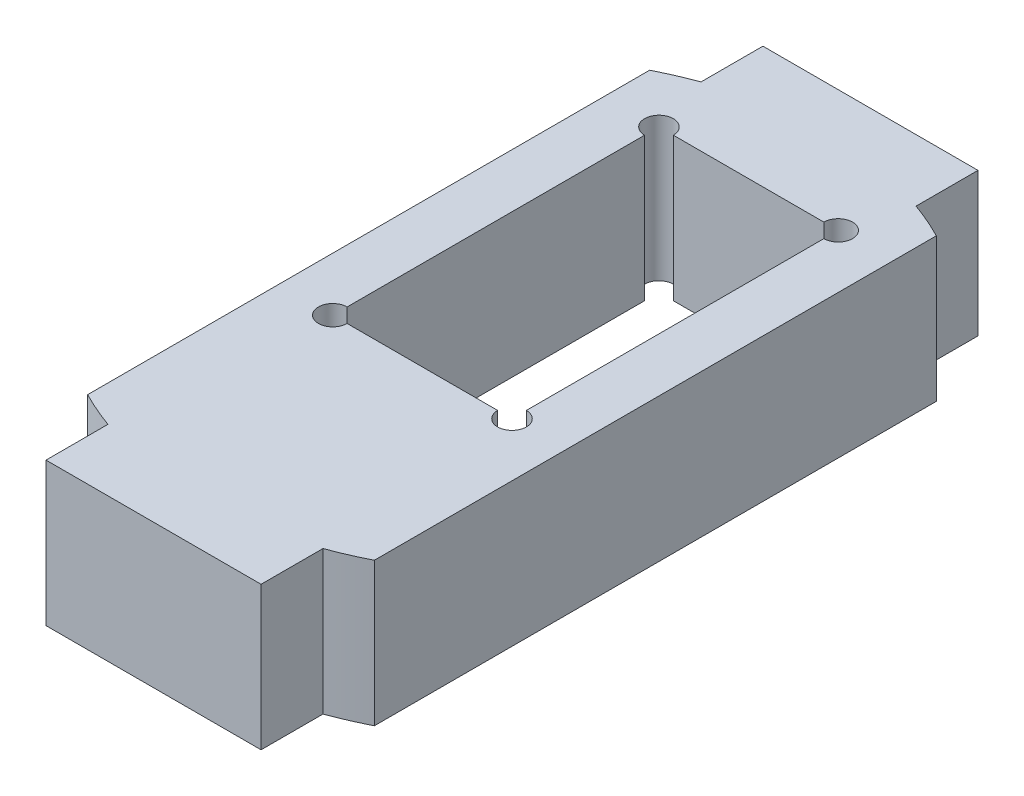
ISO-10303-21;
HEADER;
FILE_DESCRIPTION(('STEP AP214'),'2;1');
FILE_NAME('part.step','',(''),(''),'','','');
FILE_SCHEMA(('AUTOMOTIVE_DESIGN { 1 0 10303 214 1 1 1 1 }'));
ENDSEC;
DATA;
#1=APPLICATION_CONTEXT('core data for automotive mechanical design processes');
#2=APPLICATION_PROTOCOL_DEFINITION('international standard','automotive_design',2000,#1);
#3=PRODUCT_CONTEXT('',#1,'mechanical');
#4=PRODUCT('Part','Part','',(#3));
#5=PRODUCT_RELATED_PRODUCT_CATEGORY('part','',(#4));
#6=PRODUCT_DEFINITION_FORMATION('','',#4);
#7=PRODUCT_DEFINITION_CONTEXT('part definition',#1,'design');
#8=PRODUCT_DEFINITION('design','',#6,#7);
#9=PRODUCT_DEFINITION_SHAPE('','',#8);
#10=(LENGTH_UNIT() NAMED_UNIT(*) SI_UNIT(.MILLI.,.METRE.));
#11=(NAMED_UNIT(*) PLANE_ANGLE_UNIT() SI_UNIT($,.RADIAN.));
#12=(NAMED_UNIT(*) SI_UNIT($,.STERADIAN.) SOLID_ANGLE_UNIT());
#13=UNCERTAINTY_MEASURE_WITH_UNIT(LENGTH_MEASURE(1.E-05),#10,'distance_accuracy_value','');
#14=(GEOMETRIC_REPRESENTATION_CONTEXT(3) GLOBAL_UNCERTAINTY_ASSIGNED_CONTEXT((#13)) GLOBAL_UNIT_ASSIGNED_CONTEXT((#10,
#11,#12)) REPRESENTATION_CONTEXT('',''));
#15=CARTESIAN_POINT('',(0.,0.,0.));
#16=DIRECTION('',(0.,0.,1.));
#17=DIRECTION('',(1.,0.,0.));
#18=AXIS2_PLACEMENT_3D('',#15,#16,#17);
#19=CARTESIAN_POINT('',(0.,10.,0.));
#20=DIRECTION('',(0.,-1.,0.));
#21=DIRECTION('',(0.,0.,-1.));
#22=AXIS2_PLACEMENT_3D('',#19,#20,#21);
#23=CYLINDRICAL_SURFACE('',#22,22.);
#24=CARTESIAN_POINT('',(0.,0.,0.));
#25=DIRECTION('',(0.,1.,0.));
#26=DIRECTION('',(0.,0.,1.));
#27=AXIS2_PLACEMENT_3D('',#24,#25,#26);
#28=CIRCLE('',#27,22.);
#29=CARTESIAN_POINT('',(-7.49999999999999,0.,-20.6821178799464));
#30=VERTEX_POINT('',#29);
#31=CARTESIAN_POINT('',(-10.,0.,-19.5959179422654));
#32=VERTEX_POINT('',#31);
#33=EDGE_CURVE('E226',#30,#32,#28,.T.);
#34=ORIENTED_EDGE('',*,*,#33,.T.);
#35=DIRECTION('',(0.,-1.,0.));
#36=VECTOR('',#35,1.);
#37=CARTESIAN_POINT('',(-10.,10.,-19.5959179422654));
#38=LINE('',#37,#36);
#39=CARTESIAN_POINT('',(-10.,10.,-19.5959179422654));
#40=VERTEX_POINT('',#39);
#41=EDGE_CURVE('E11',#40,#32,#38,.T.);
#42=ORIENTED_EDGE('',*,*,#41,.F.);
#43=CARTESIAN_POINT('',(0.,10.,0.));
#44=DIRECTION('',(0.,1.,0.));
#45=DIRECTION('',(0.,0.,1.));
#46=AXIS2_PLACEMENT_3D('',#43,#44,#45);
#47=CIRCLE('',#46,22.);
#48=CARTESIAN_POINT('',(-7.49999999999999,10.,-20.6821178799464));
#49=VERTEX_POINT('',#48);
#50=EDGE_CURVE('E238',#49,#40,#47,.T.);
#51=ORIENTED_EDGE('',*,*,#50,.F.);
#52=DIRECTION('',(0.,-1.,0.));
#53=VECTOR('',#52,1.);
#54=CARTESIAN_POINT('',(-7.49999999999999,10.,-20.6821178799464));
#55=LINE('',#54,#53);
#56=EDGE_CURVE('E264',#49,#30,#55,.T.);
#57=ORIENTED_EDGE('',*,*,#56,.T.);
#58=EDGE_LOOP('',(#34,#42,#51,#57));
#59=FACE_BOUND('',#58,.T.);
#60=ADVANCED_FACE('F33',(#59),#23,.T.);
#61=CARTESIAN_POINT('',(-9.99999999999999,10.,19.5959179422654));
#62=DIRECTION('',(1.,0.,0.));
#63=DIRECTION('',(0.,0.,-1.));
#64=AXIS2_PLACEMENT_3D('',#61,#62,#63);
#65=PLANE('',#64);
#66=DIRECTION('',(0.,0.,1.));
#67=VECTOR('',#66,1.);
#68=CARTESIAN_POINT('',(-9.99999999999999,0.,19.5959179422654));
#69=LINE('',#68,#67);
#70=CARTESIAN_POINT('',(-9.99999999999998,0.,19.5959179422654));
#71=VERTEX_POINT('',#70);
#72=EDGE_CURVE('E267',#32,#71,#69,.T.);
#73=ORIENTED_EDGE('',*,*,#72,.T.);
#74=DIRECTION('',(0.,-1.,0.));
#75=VECTOR('',#74,1.);
#76=CARTESIAN_POINT('',(-9.99999999999998,10.,19.5959179422654));
#77=LINE('',#76,#75);
#78=CARTESIAN_POINT('',(-9.99999999999998,10.,19.5959179422654));
#79=VERTEX_POINT('',#78);
#80=EDGE_CURVE('E40',#79,#71,#77,.T.);
#81=ORIENTED_EDGE('',*,*,#80,.F.);
#82=DIRECTION('',(0.,0.,1.));
#83=VECTOR('',#82,1.);
#84=CARTESIAN_POINT('',(-9.99999999999999,10.,19.5959179422654));
#85=LINE('',#84,#83);
#86=EDGE_CURVE('E241',#40,#79,#85,.T.);
#87=ORIENTED_EDGE('',*,*,#86,.F.);
#88=ORIENTED_EDGE('',*,*,#41,.T.);
#89=EDGE_LOOP('',(#73,#81,#87,#88));
#90=FACE_BOUND('',#89,.T.);
#91=ADVANCED_FACE('F342',(#90),#65,.F.);
#92=CARTESIAN_POINT('',(0.,10.,0.));
#93=DIRECTION('',(0.,-1.,0.));
#94=DIRECTION('',(0.,0.,-1.));
#95=AXIS2_PLACEMENT_3D('',#92,#93,#94);
#96=CYLINDRICAL_SURFACE('',#95,22.);
#97=CARTESIAN_POINT('',(0.,0.,0.));
#98=DIRECTION('',(0.,1.,0.));
#99=DIRECTION('',(0.,0.,1.));
#100=AXIS2_PLACEMENT_3D('',#97,#98,#99);
#101=CIRCLE('',#100,22.);
#102=CARTESIAN_POINT('',(-7.49999999999998,0.,20.6821178799464));
#103=VERTEX_POINT('',#102);
#104=EDGE_CURVE('E269',#71,#103,#101,.T.);
#105=ORIENTED_EDGE('',*,*,#104,.T.);
#106=DIRECTION('',(0.,-1.,0.));
#107=VECTOR('',#106,1.);
#108=CARTESIAN_POINT('',(-7.49999999999998,10.,20.6821178799464));
#109=LINE('',#108,#107);
#110=CARTESIAN_POINT('',(-7.49999999999998,10.,20.6821178799464));
#111=VERTEX_POINT('',#110);
#112=EDGE_CURVE('E314',#111,#103,#109,.T.);
#113=ORIENTED_EDGE('',*,*,#112,.F.);
#114=CARTESIAN_POINT('',(0.,10.,0.));
#115=DIRECTION('',(0.,1.,0.));
#116=DIRECTION('',(0.,0.,1.));
#117=AXIS2_PLACEMENT_3D('',#114,#115,#116);
#118=CIRCLE('',#117,22.);
#119=EDGE_CURVE('E244',#79,#111,#118,.T.);
#120=ORIENTED_EDGE('',*,*,#119,.F.);
#121=ORIENTED_EDGE('',*,*,#80,.T.);
#122=EDGE_LOOP('',(#105,#113,#120,#121));
#123=FACE_BOUND('',#122,.T.);
#124=ADVANCED_FACE('F321',(#123),#96,.T.);
#125=CARTESIAN_POINT('',(-7.49999999999999,10.,25.));
#126=DIRECTION('',(1.,0.,0.));
#127=DIRECTION('',(0.,0.,-1.));
#128=AXIS2_PLACEMENT_3D('',#125,#126,#127);
#129=PLANE('',#128);
#130=DIRECTION('',(0.,0.,1.));
#131=VECTOR('',#130,1.);
#132=CARTESIAN_POINT('',(-7.49999999999999,0.,25.));
#133=LINE('',#132,#131);
#134=CARTESIAN_POINT('',(-7.49999999999999,0.,25.));
#135=VERTEX_POINT('',#134);
#136=EDGE_CURVE('E271',#103,#135,#133,.T.);
#137=ORIENTED_EDGE('',*,*,#136,.T.);
#138=DIRECTION('',(0.,-1.,0.));
#139=VECTOR('',#138,1.);
#140=CARTESIAN_POINT('',(-7.49999999999999,10.,25.));
#141=LINE('',#140,#139);
#142=CARTESIAN_POINT('',(-7.49999999999999,10.,25.));
#143=VERTEX_POINT('',#142);
#144=EDGE_CURVE('E311',#143,#135,#141,.T.);
#145=ORIENTED_EDGE('',*,*,#144,.F.);
#146=DIRECTION('',(0.,0.,1.));
#147=VECTOR('',#146,1.);
#148=CARTESIAN_POINT('',(-7.49999999999999,10.,25.));
#149=LINE('',#148,#147);
#150=EDGE_CURVE('E246',#111,#143,#149,.T.);
#151=ORIENTED_EDGE('',*,*,#150,.F.);
#152=ORIENTED_EDGE('',*,*,#112,.T.);
#153=EDGE_LOOP('',(#137,#145,#151,#152));
#154=FACE_BOUND('',#153,.T.);
#155=ADVANCED_FACE('F330',(#154),#129,.F.);
#156=CARTESIAN_POINT('',(-7.49999999999999,10.,25.));
#157=DIRECTION('',(0.,0.,-1.));
#158=DIRECTION('',(-1.,0.,0.));
#159=AXIS2_PLACEMENT_3D('',#156,#157,#158);
#160=PLANE('',#159);
#161=DIRECTION('',(1.,0.,0.));
#162=VECTOR('',#161,1.);
#163=CARTESIAN_POINT('',(-7.49999999999999,0.,25.));
#164=LINE('',#163,#162);
#165=CARTESIAN_POINT('',(7.50000000000002,0.,25.));
#166=VERTEX_POINT('',#165);
#167=EDGE_CURVE('E273',#135,#166,#164,.T.);
#168=ORIENTED_EDGE('',*,*,#167,.T.);
#169=DIRECTION('',(0.,-1.,0.));
#170=VECTOR('',#169,1.);
#171=CARTESIAN_POINT('',(7.50000000000002,10.,25.));
#172=LINE('',#171,#170);
#173=CARTESIAN_POINT('',(7.50000000000002,10.,25.));
#174=VERTEX_POINT('',#173);
#175=EDGE_CURVE('E308',#174,#166,#172,.T.);
#176=ORIENTED_EDGE('',*,*,#175,.F.);
#177=DIRECTION('',(1.,0.,0.));
#178=VECTOR('',#177,1.);
#179=CARTESIAN_POINT('',(-7.49999999999999,10.,25.));
#180=LINE('',#179,#178);
#181=EDGE_CURVE('E248',#143,#174,#180,.T.);
#182=ORIENTED_EDGE('',*,*,#181,.F.);
#183=ORIENTED_EDGE('',*,*,#144,.T.);
#184=EDGE_LOOP('',(#168,#176,#182,#183));
#185=FACE_BOUND('',#184,.T.);
#186=ADVANCED_FACE('F334',(#185),#160,.F.);
#187=CARTESIAN_POINT('',(7.50000000000002,10.,25.));
#188=DIRECTION('',(-1.,0.,0.));
#189=DIRECTION('',(0.,0.,1.));
#190=AXIS2_PLACEMENT_3D('',#187,#188,#189);
#191=PLANE('',#190);
#192=DIRECTION('',(0.,0.,-1.));
#193=VECTOR('',#192,1.);
#194=CARTESIAN_POINT('',(7.50000000000002,0.,25.));
#195=LINE('',#194,#193);
#196=CARTESIAN_POINT('',(7.50000000000001,0.,20.6821178799464));
#197=VERTEX_POINT('',#196);
#198=EDGE_CURVE('E275',#166,#197,#195,.T.);
#199=ORIENTED_EDGE('',*,*,#198,.T.);
#200=DIRECTION('',(0.,-1.,0.));
#201=VECTOR('',#200,1.);
#202=CARTESIAN_POINT('',(7.50000000000001,10.,20.6821178799464));
#203=LINE('',#202,#201);
#204=CARTESIAN_POINT('',(7.50000000000001,10.,20.6821178799464));
#205=VERTEX_POINT('',#204);
#206=EDGE_CURVE('E305',#205,#197,#203,.T.);
#207=ORIENTED_EDGE('',*,*,#206,.F.);
#208=DIRECTION('',(0.,0.,-1.));
#209=VECTOR('',#208,1.);
#210=CARTESIAN_POINT('',(7.50000000000002,10.,25.));
#211=LINE('',#210,#209);
#212=EDGE_CURVE('E250',#174,#205,#211,.T.);
#213=ORIENTED_EDGE('',*,*,#212,.F.);
#214=ORIENTED_EDGE('',*,*,#175,.T.);
#215=EDGE_LOOP('',(#199,#207,#213,#214));
#216=FACE_BOUND('',#215,.T.);
#217=ADVANCED_FACE('F375',(#216),#191,.F.);
#218=CARTESIAN_POINT('',(0.,10.,0.));
#219=DIRECTION('',(0.,-1.,0.));
#220=DIRECTION('',(0.,0.,-1.));
#221=AXIS2_PLACEMENT_3D('',#218,#219,#220);
#222=CYLINDRICAL_SURFACE('',#221,22.);
#223=CARTESIAN_POINT('',(0.,0.,0.));
#224=DIRECTION('',(0.,1.,0.));
#225=DIRECTION('',(0.,0.,1.));
#226=AXIS2_PLACEMENT_3D('',#223,#224,#225);
#227=CIRCLE('',#226,22.);
#228=CARTESIAN_POINT('',(10.,0.,19.5959179422654));
#229=VERTEX_POINT('',#228);
#230=EDGE_CURVE('E277',#197,#229,#227,.T.);
#231=ORIENTED_EDGE('',*,*,#230,.T.);
#232=DIRECTION('',(0.,-1.,0.));
#233=VECTOR('',#232,1.);
#234=CARTESIAN_POINT('',(10.,10.,19.5959179422654));
#235=LINE('',#234,#233);
#236=CARTESIAN_POINT('',(10.,10.,19.5959179422654));
#237=VERTEX_POINT('',#236);
#238=EDGE_CURVE('E302',#237,#229,#235,.T.);
#239=ORIENTED_EDGE('',*,*,#238,.F.);
#240=CARTESIAN_POINT('',(0.,10.,0.));
#241=DIRECTION('',(0.,1.,0.));
#242=DIRECTION('',(0.,0.,1.));
#243=AXIS2_PLACEMENT_3D('',#240,#241,#242);
#244=CIRCLE('',#243,22.);
#245=EDGE_CURVE('E252',#205,#237,#244,.T.);
#246=ORIENTED_EDGE('',*,*,#245,.F.);
#247=ORIENTED_EDGE('',*,*,#206,.T.);
#248=EDGE_LOOP('',(#231,#239,#246,#247));
#249=FACE_BOUND('',#248,.T.);
#250=ADVANCED_FACE('F373',(#249),#222,.T.);
#251=CARTESIAN_POINT('',(10.,10.,19.5959179422654));
#252=DIRECTION('',(-1.,0.,0.));
#253=DIRECTION('',(0.,0.,1.));
#254=AXIS2_PLACEMENT_3D('',#251,#252,#253);
#255=PLANE('',#254);
#256=DIRECTION('',(0.,0.,-1.));
#257=VECTOR('',#256,1.);
#258=CARTESIAN_POINT('',(10.,0.,19.5959179422654));
#259=LINE('',#258,#257);
#260=CARTESIAN_POINT('',(10.,0.,-19.5959179422654));
#261=VERTEX_POINT('',#260);
#262=EDGE_CURVE('E279',#229,#261,#259,.T.);
#263=ORIENTED_EDGE('',*,*,#262,.T.);
#264=DIRECTION('',(0.,-1.,0.));
#265=VECTOR('',#264,1.);
#266=CARTESIAN_POINT('',(10.,10.,-19.5959179422654));
#267=LINE('',#266,#265);
#268=CARTESIAN_POINT('',(10.,10.,-19.5959179422654));
#269=VERTEX_POINT('',#268);
#270=EDGE_CURVE('E299',#269,#261,#267,.T.);
#271=ORIENTED_EDGE('',*,*,#270,.F.);
#272=DIRECTION('',(0.,0.,-1.));
#273=VECTOR('',#272,1.);
#274=CARTESIAN_POINT('',(10.,10.,19.5959179422654));
#275=LINE('',#274,#273);
#276=EDGE_CURVE('E254',#237,#269,#275,.T.);
#277=ORIENTED_EDGE('',*,*,#276,.F.);
#278=ORIENTED_EDGE('',*,*,#238,.T.);
#279=EDGE_LOOP('',(#263,#271,#277,#278));
#280=FACE_BOUND('',#279,.T.);
#281=ADVANCED_FACE('F369',(#280),#255,.F.);
#282=CARTESIAN_POINT('',(0.,10.,0.));
#283=DIRECTION('',(0.,-1.,0.));
#284=DIRECTION('',(0.,0.,-1.));
#285=AXIS2_PLACEMENT_3D('',#282,#283,#284);
#286=CYLINDRICAL_SURFACE('',#285,22.);
#287=CARTESIAN_POINT('',(0.,0.,0.));
#288=DIRECTION('',(0.,1.,0.));
#289=DIRECTION('',(0.,0.,1.));
#290=AXIS2_PLACEMENT_3D('',#287,#288,#289);
#291=CIRCLE('',#290,22.);
#292=CARTESIAN_POINT('',(7.50000000000001,0.,-20.6821178799464));
#293=VERTEX_POINT('',#292);
#294=EDGE_CURVE('E281',#261,#293,#291,.T.);
#295=ORIENTED_EDGE('',*,*,#294,.T.);
#296=DIRECTION('',(0.,-1.,0.));
#297=VECTOR('',#296,1.);
#298=CARTESIAN_POINT('',(7.50000000000001,10.,-20.6821178799464));
#299=LINE('',#298,#297);
#300=CARTESIAN_POINT('',(7.50000000000001,10.,-20.6821178799464));
#301=VERTEX_POINT('',#300);
#302=EDGE_CURVE('E296',#301,#293,#299,.T.);
#303=ORIENTED_EDGE('',*,*,#302,.F.);
#304=CARTESIAN_POINT('',(0.,10.,0.));
#305=DIRECTION('',(0.,1.,0.));
#306=DIRECTION('',(0.,0.,1.));
#307=AXIS2_PLACEMENT_3D('',#304,#305,#306);
#308=CIRCLE('',#307,22.);
#309=EDGE_CURVE('E256',#269,#301,#308,.T.);
#310=ORIENTED_EDGE('',*,*,#309,.F.);
#311=ORIENTED_EDGE('',*,*,#270,.T.);
#312=EDGE_LOOP('',(#295,#303,#310,#311));
#313=FACE_BOUND('',#312,.T.);
#314=ADVANCED_FACE('F364',(#313),#286,.T.);
#315=CARTESIAN_POINT('',(7.50000000000001,10.,-20.6821178799464));
#316=DIRECTION('',(-1.,0.,0.));
#317=DIRECTION('',(0.,0.,1.));
#318=AXIS2_PLACEMENT_3D('',#315,#316,#317);
#319=PLANE('',#318);
#320=DIRECTION('',(0.,0.,-1.));
#321=VECTOR('',#320,1.);
#322=CARTESIAN_POINT('',(7.50000000000001,0.,-20.6821178799464));
#323=LINE('',#322,#321);
#324=CARTESIAN_POINT('',(7.50000000000001,0.,-25.));
#325=VERTEX_POINT('',#324);
#326=EDGE_CURVE('E283',#293,#325,#323,.T.);
#327=ORIENTED_EDGE('',*,*,#326,.T.);
#328=DIRECTION('',(0.,-1.,0.));
#329=VECTOR('',#328,1.);
#330=CARTESIAN_POINT('',(7.50000000000001,10.,-25.));
#331=LINE('',#330,#329);
#332=CARTESIAN_POINT('',(7.50000000000001,10.,-25.));
#333=VERTEX_POINT('',#332);
#334=EDGE_CURVE('E293',#333,#325,#331,.T.);
#335=ORIENTED_EDGE('',*,*,#334,.F.);
#336=DIRECTION('',(0.,0.,-1.));
#337=VECTOR('',#336,1.);
#338=CARTESIAN_POINT('',(7.50000000000001,10.,-20.6821178799464));
#339=LINE('',#338,#337);
#340=EDGE_CURVE('E258',#301,#333,#339,.T.);
#341=ORIENTED_EDGE('',*,*,#340,.F.);
#342=ORIENTED_EDGE('',*,*,#302,.T.);
#343=EDGE_LOOP('',(#327,#335,#341,#342));
#344=FACE_BOUND('',#343,.T.);
#345=ADVANCED_FACE('F358',(#344),#319,.F.);
#346=CARTESIAN_POINT('',(-7.49999999999999,10.,-25.));
#347=DIRECTION('',(0.,0.,1.));
#348=DIRECTION('',(1.,0.,0.));
#349=AXIS2_PLACEMENT_3D('',#346,#347,#348);
#350=PLANE('',#349);
#351=DIRECTION('',(-1.,0.,0.));
#352=VECTOR('',#351,1.);
#353=CARTESIAN_POINT('',(-7.49999999999999,0.,-25.));
#354=LINE('',#353,#352);
#355=CARTESIAN_POINT('',(-7.49999999999999,0.,-25.));
#356=VERTEX_POINT('',#355);
#357=EDGE_CURVE('E285',#325,#356,#354,.T.);
#358=ORIENTED_EDGE('',*,*,#357,.T.);
#359=DIRECTION('',(0.,-1.,0.));
#360=VECTOR('',#359,1.);
#361=CARTESIAN_POINT('',(-7.49999999999999,10.,-25.));
#362=LINE('',#361,#360);
#363=CARTESIAN_POINT('',(-7.49999999999999,10.,-25.));
#364=VERTEX_POINT('',#363);
#365=EDGE_CURVE('E290',#364,#356,#362,.T.);
#366=ORIENTED_EDGE('',*,*,#365,.F.);
#367=DIRECTION('',(-1.,0.,0.));
#368=VECTOR('',#367,1.);
#369=CARTESIAN_POINT('',(-7.49999999999999,10.,-25.));
#370=LINE('',#369,#368);
#371=EDGE_CURVE('E260',#333,#364,#370,.T.);
#372=ORIENTED_EDGE('',*,*,#371,.F.);
#373=ORIENTED_EDGE('',*,*,#334,.T.);
#374=EDGE_LOOP('',(#358,#366,#372,#373));
#375=FACE_BOUND('',#374,.T.);
#376=ADVANCED_FACE('F354',(#375),#350,.F.);
#377=CARTESIAN_POINT('',(-7.49999999999999,10.,-20.6821178799464));
#378=DIRECTION('',(1.,0.,0.));
#379=DIRECTION('',(0.,0.,-1.));
#380=AXIS2_PLACEMENT_3D('',#377,#378,#379);
#381=PLANE('',#380);
#382=DIRECTION('',(0.,0.,1.));
#383=VECTOR('',#382,1.);
#384=CARTESIAN_POINT('',(-7.49999999999999,0.,-20.6821178799464));
#385=LINE('',#384,#383);
#386=EDGE_CURVE('E242',#356,#30,#385,.T.);
#387=ORIENTED_EDGE('',*,*,#386,.T.);
#388=ORIENTED_EDGE('',*,*,#56,.F.);
#389=DIRECTION('',(0.,0.,1.));
#390=VECTOR('',#389,1.);
#391=CARTESIAN_POINT('',(-7.49999999999999,10.,-20.6821178799464));
#392=LINE('',#391,#390);
#393=EDGE_CURVE('E262',#364,#49,#392,.T.);
#394=ORIENTED_EDGE('',*,*,#393,.F.);
#395=ORIENTED_EDGE('',*,*,#365,.T.);
#396=EDGE_LOOP('',(#387,#388,#394,#395));
#397=FACE_BOUND('',#396,.T.);
#398=ADVANCED_FACE('F349',(#397),#381,.F.);
#399=CARTESIAN_POINT('',(0.,10.,0.));
#400=DIRECTION('',(0.,1.,0.));
#401=DIRECTION('',(0.,0.,1.));
#402=AXIS2_PLACEMENT_3D('',#399,#400,#401);
#403=PLANE('',#402);
#404=CARTESIAN_POINT('',(-6.25000000000001,10.,-16.5));
#405=DIRECTION('',(0.,1.,0.));
#406=DIRECTION('',(0.,0.,1.));
#407=AXIS2_PLACEMENT_3D('',#404,#405,#406);
#408=CIRCLE('',#407,1.);
#409=CARTESIAN_POINT('',(-5.25000000000001,10.,-16.5));
#410=VERTEX_POINT('',#409);
#411=CARTESIAN_POINT('',(-6.25000000000001,10.,-15.5));
#412=VERTEX_POINT('',#411);
#413=EDGE_CURVE('E47',#410,#412,#408,.T.);
#414=ORIENTED_EDGE('',*,*,#413,.F.);
#415=DIRECTION('',(-1.,0.,0.));
#416=VECTOR('',#415,1.);
#417=CARTESIAN_POINT('',(5.24999999999999,10.,-16.5));
#418=LINE('',#417,#416);
#419=CARTESIAN_POINT('',(5.24999999999999,10.,-16.5));
#420=VERTEX_POINT('',#419);
#421=EDGE_CURVE('E188',#420,#410,#418,.T.);
#422=ORIENTED_EDGE('',*,*,#421,.F.);
#423=CARTESIAN_POINT('',(6.24999999999999,10.,-16.5));
#424=DIRECTION('',(0.,1.,0.));
#425=DIRECTION('',(0.,0.,1.));
#426=AXIS2_PLACEMENT_3D('',#423,#424,#425);
#427=CIRCLE('',#426,1.);
#428=CARTESIAN_POINT('',(6.24999999999999,10.,-15.5));
#429=VERTEX_POINT('',#428);
#430=EDGE_CURVE('E191',#429,#420,#427,.T.);
#431=ORIENTED_EDGE('',*,*,#430,.F.);
#432=DIRECTION('',(0.,0.,-1.));
#433=VECTOR('',#432,1.);
#434=CARTESIAN_POINT('',(6.24999999999999,10.,-15.5));
#435=LINE('',#434,#433);
#436=CARTESIAN_POINT('',(6.24999999999999,10.,5.25));
#437=VERTEX_POINT('',#436);
#438=EDGE_CURVE('E219',#437,#429,#435,.T.);
#439=ORIENTED_EDGE('',*,*,#438,.F.);
#440=CARTESIAN_POINT('',(6.24999999999999,10.,6.25));
#441=DIRECTION('',(0.,1.,0.));
#442=DIRECTION('',(0.,0.,1.));
#443=AXIS2_PLACEMENT_3D('',#440,#441,#442);
#444=CIRCLE('',#443,1.);
#445=CARTESIAN_POINT('',(5.24999999999999,10.,6.25));
#446=VERTEX_POINT('',#445);
#447=EDGE_CURVE('E216',#446,#437,#444,.T.);
#448=ORIENTED_EDGE('',*,*,#447,.F.);
#449=DIRECTION('',(1.,0.,0.));
#450=VECTOR('',#449,1.);
#451=CARTESIAN_POINT('',(5.24999999999999,10.,6.25));
#452=LINE('',#451,#450);
#453=CARTESIAN_POINT('',(-5.25,10.,6.25));
#454=VERTEX_POINT('',#453);
#455=EDGE_CURVE('E213',#454,#446,#452,.T.);
#456=ORIENTED_EDGE('',*,*,#455,.F.);
#457=CARTESIAN_POINT('',(-6.25,10.,6.25));
#458=DIRECTION('',(0.,1.,0.));
#459=DIRECTION('',(0.,0.,1.));
#460=AXIS2_PLACEMENT_3D('',#457,#458,#459);
#461=CIRCLE('',#460,1.);
#462=CARTESIAN_POINT('',(-6.25,10.,5.25));
#463=VERTEX_POINT('',#462);
#464=EDGE_CURVE('E210',#463,#454,#461,.T.);
#465=ORIENTED_EDGE('',*,*,#464,.F.);
#466=DIRECTION('',(0.,0.,1.));
#467=VECTOR('',#466,1.);
#468=CARTESIAN_POINT('',(-6.25000000000001,10.,-15.5));
#469=LINE('',#468,#467);
#470=EDGE_CURVE('E208',#412,#463,#469,.T.);
#471=ORIENTED_EDGE('',*,*,#470,.F.);
#472=EDGE_LOOP('',(#414,#422,#431,#439,#448,#456,#465,#471));
#473=FACE_BOUND('',#472,.T.);
#474=ORIENTED_EDGE('',*,*,#50,.T.);
#475=ORIENTED_EDGE('',*,*,#86,.T.);
#476=ORIENTED_EDGE('',*,*,#119,.T.);
#477=ORIENTED_EDGE('',*,*,#150,.T.);
#478=ORIENTED_EDGE('',*,*,#181,.T.);
#479=ORIENTED_EDGE('',*,*,#212,.T.);
#480=ORIENTED_EDGE('',*,*,#245,.T.);
#481=ORIENTED_EDGE('',*,*,#276,.T.);
#482=ORIENTED_EDGE('',*,*,#309,.T.);
#483=ORIENTED_EDGE('',*,*,#340,.T.);
#484=ORIENTED_EDGE('',*,*,#371,.T.);
#485=ORIENTED_EDGE('',*,*,#393,.T.);
#486=EDGE_LOOP('',(#474,#475,#476,#477,#478,#479,#480,#481,#482,#483,#484,#485));
#487=FACE_BOUND('',#486,.T.);
#488=ADVANCED_FACE('F338',(#473,#487),#403,.T.);
#489=CARTESIAN_POINT('',(0.,0.,0.));
#490=DIRECTION('',(0.,1.,0.));
#491=DIRECTION('',(0.,0.,1.));
#492=AXIS2_PLACEMENT_3D('',#489,#490,#491);
#493=PLANE('',#492);
#494=DIRECTION('',(-1.,0.,0.));
#495=VECTOR('',#494,1.);
#496=CARTESIAN_POINT('',(5.24999999999999,0.,-16.5));
#497=LINE('',#496,#495);
#498=CARTESIAN_POINT('',(5.24999999999999,0.,-16.5));
#499=VERTEX_POINT('',#498);
#500=CARTESIAN_POINT('',(-5.25000000000001,0.,-16.5));
#501=VERTEX_POINT('',#500);
#502=EDGE_CURVE('E177',#499,#501,#497,.T.);
#503=ORIENTED_EDGE('',*,*,#502,.T.);
#504=CARTESIAN_POINT('',(-6.25000000000001,0.,-16.5));
#505=DIRECTION('',(0.,1.,0.));
#506=DIRECTION('',(0.,0.,1.));
#507=AXIS2_PLACEMENT_3D('',#504,#505,#506);
#508=CIRCLE('',#507,1.);
#509=CARTESIAN_POINT('',(-6.25000000000001,0.,-15.5));
#510=VERTEX_POINT('',#509);
#511=EDGE_CURVE('E171',#501,#510,#508,.T.);
#512=ORIENTED_EDGE('',*,*,#511,.T.);
#513=DIRECTION('',(0.,0.,1.));
#514=VECTOR('',#513,1.);
#515=CARTESIAN_POINT('',(-6.25000000000001,0.,-15.5));
#516=LINE('',#515,#514);
#517=CARTESIAN_POINT('',(-6.25,0.,5.25));
#518=VERTEX_POINT('',#517);
#519=EDGE_CURVE('E180',#510,#518,#516,.T.);
#520=ORIENTED_EDGE('',*,*,#519,.T.);
#521=CARTESIAN_POINT('',(-6.25,0.,6.25));
#522=DIRECTION('',(0.,1.,0.));
#523=DIRECTION('',(0.,0.,1.));
#524=AXIS2_PLACEMENT_3D('',#521,#522,#523);
#525=CIRCLE('',#524,1.);
#526=CARTESIAN_POINT('',(-5.25,0.,6.25));
#527=VERTEX_POINT('',#526);
#528=EDGE_CURVE('E55',#518,#527,#525,.T.);
#529=ORIENTED_EDGE('',*,*,#528,.T.);
#530=DIRECTION('',(1.,0.,0.));
#531=VECTOR('',#530,1.);
#532=CARTESIAN_POINT('',(5.24999999999999,0.,6.25));
#533=LINE('',#532,#531);
#534=CARTESIAN_POINT('',(5.24999999999999,0.,6.25));
#535=VERTEX_POINT('',#534);
#536=EDGE_CURVE('E195',#527,#535,#533,.T.);
#537=ORIENTED_EDGE('',*,*,#536,.T.);
#538=CARTESIAN_POINT('',(6.24999999999999,0.,6.25));
#539=DIRECTION('',(0.,1.,0.));
#540=DIRECTION('',(0.,0.,1.));
#541=AXIS2_PLACEMENT_3D('',#538,#539,#540);
#542=CIRCLE('',#541,1.);
#543=CARTESIAN_POINT('',(6.24999999999999,0.,5.25));
#544=VERTEX_POINT('',#543);
#545=EDGE_CURVE('E198',#535,#544,#542,.T.);
#546=ORIENTED_EDGE('',*,*,#545,.T.);
#547=DIRECTION('',(0.,0.,-1.));
#548=VECTOR('',#547,1.);
#549=CARTESIAN_POINT('',(6.24999999999999,0.,-15.5));
#550=LINE('',#549,#548);
#551=CARTESIAN_POINT('',(6.24999999999999,0.,-15.5));
#552=VERTEX_POINT('',#551);
#553=EDGE_CURVE('E201',#544,#552,#550,.T.);
#554=ORIENTED_EDGE('',*,*,#553,.T.);
#555=CARTESIAN_POINT('',(6.24999999999999,0.,-16.5));
#556=DIRECTION('',(0.,1.,0.));
#557=DIRECTION('',(0.,0.,1.));
#558=AXIS2_PLACEMENT_3D('',#555,#556,#557);
#559=CIRCLE('',#558,1.);
#560=EDGE_CURVE('E204',#552,#499,#559,.T.);
#561=ORIENTED_EDGE('',*,*,#560,.T.);
#562=EDGE_LOOP('',(#503,#512,#520,#529,#537,#546,#554,#561));
#563=FACE_BOUND('',#562,.T.);
#564=ORIENTED_EDGE('',*,*,#33,.F.);
#565=ORIENTED_EDGE('',*,*,#386,.F.);
#566=ORIENTED_EDGE('',*,*,#357,.F.);
#567=ORIENTED_EDGE('',*,*,#326,.F.);
#568=ORIENTED_EDGE('',*,*,#294,.F.);
#569=ORIENTED_EDGE('',*,*,#262,.F.);
#570=ORIENTED_EDGE('',*,*,#230,.F.);
#571=ORIENTED_EDGE('',*,*,#198,.F.);
#572=ORIENTED_EDGE('',*,*,#167,.F.);
#573=ORIENTED_EDGE('',*,*,#136,.F.);
#574=ORIENTED_EDGE('',*,*,#104,.F.);
#575=ORIENTED_EDGE('',*,*,#72,.F.);
#576=EDGE_LOOP('',(#564,#565,#566,#567,#568,#569,#570,#571,#572,#573,#574,#575));
#577=FACE_BOUND('',#576,.T.);
#578=ADVANCED_FACE('F184',(#563,#577),#493,.F.);
#579=CARTESIAN_POINT('',(-6.25000000000001,0.,-16.5));
#580=DIRECTION('',(0.,1.,0.));
#581=DIRECTION('',(0.,0.,1.));
#582=AXIS2_PLACEMENT_3D('',#579,#580,#581);
#583=CYLINDRICAL_SURFACE('',#582,1.);
#584=ORIENTED_EDGE('',*,*,#413,.T.);
#585=DIRECTION('',(0.,1.,0.));
#586=VECTOR('',#585,1.);
#587=CARTESIAN_POINT('',(-6.25000000000001,0.,-15.5));
#588=LINE('',#587,#586);
#589=EDGE_CURVE('E167',#510,#412,#588,.T.);
#590=ORIENTED_EDGE('',*,*,#589,.F.);
#591=ORIENTED_EDGE('',*,*,#511,.F.);
#592=DIRECTION('',(0.,1.,0.));
#593=VECTOR('',#592,1.);
#594=CARTESIAN_POINT('',(-5.25000000000001,0.,-16.5));
#595=LINE('',#594,#593);
#596=EDGE_CURVE('E224',#501,#410,#595,.T.);
#597=ORIENTED_EDGE('',*,*,#596,.T.);
#598=EDGE_LOOP('',(#584,#590,#591,#597));
#599=FACE_BOUND('',#598,.T.);
#600=ADVANCED_FACE('F169',(#599),#583,.F.);
#601=CARTESIAN_POINT('',(5.24999999999999,0.,-16.5));
#602=DIRECTION('',(0.,0.,-1.));
#603=DIRECTION('',(-1.,0.,0.));
#604=AXIS2_PLACEMENT_3D('',#601,#602,#603);
#605=PLANE('',#604);
#606=ORIENTED_EDGE('',*,*,#421,.T.);
#607=ORIENTED_EDGE('',*,*,#596,.F.);
#608=ORIENTED_EDGE('',*,*,#502,.F.);
#609=DIRECTION('',(0.,1.,0.));
#610=VECTOR('',#609,1.);
#611=CARTESIAN_POINT('',(5.24999999999999,0.,-16.5));
#612=LINE('',#611,#610);
#613=EDGE_CURVE('E227',#499,#420,#612,.T.);
#614=ORIENTED_EDGE('',*,*,#613,.T.);
#615=EDGE_LOOP('',(#606,#607,#608,#614));
#616=FACE_BOUND('',#615,.T.);
#617=ADVANCED_FACE('F478',(#616),#605,.F.);
#618=CARTESIAN_POINT('',(6.24999999999999,0.,-16.5));
#619=DIRECTION('',(0.,1.,0.));
#620=DIRECTION('',(0.,0.,1.));
#621=AXIS2_PLACEMENT_3D('',#618,#619,#620);
#622=CYLINDRICAL_SURFACE('',#621,1.);
#623=ORIENTED_EDGE('',*,*,#430,.T.);
#624=ORIENTED_EDGE('',*,*,#613,.F.);
#625=ORIENTED_EDGE('',*,*,#560,.F.);
#626=DIRECTION('',(0.,1.,0.));
#627=VECTOR('',#626,1.);
#628=CARTESIAN_POINT('',(6.24999999999999,0.,-15.5));
#629=LINE('',#628,#627);
#630=EDGE_CURVE('E229',#552,#429,#629,.T.);
#631=ORIENTED_EDGE('',*,*,#630,.T.);
#632=EDGE_LOOP('',(#623,#624,#625,#631));
#633=FACE_BOUND('',#632,.T.);
#634=ADVANCED_FACE('F487',(#633),#622,.F.);
#635=CARTESIAN_POINT('',(6.24999999999999,0.,-15.5));
#636=DIRECTION('',(1.,0.,0.));
#637=DIRECTION('',(0.,0.,-1.));
#638=AXIS2_PLACEMENT_3D('',#635,#636,#637);
#639=PLANE('',#638);
#640=ORIENTED_EDGE('',*,*,#438,.T.);
#641=ORIENTED_EDGE('',*,*,#630,.F.);
#642=ORIENTED_EDGE('',*,*,#553,.F.);
#643=DIRECTION('',(0.,1.,0.));
#644=VECTOR('',#643,1.);
#645=CARTESIAN_POINT('',(6.24999999999999,0.,5.25));
#646=LINE('',#645,#644);
#647=EDGE_CURVE('E231',#544,#437,#646,.T.);
#648=ORIENTED_EDGE('',*,*,#647,.T.);
#649=EDGE_LOOP('',(#640,#641,#642,#648));
#650=FACE_BOUND('',#649,.T.);
#651=ADVANCED_FACE('F497',(#650),#639,.F.);
#652=CARTESIAN_POINT('',(6.24999999999999,0.,6.25));
#653=DIRECTION('',(0.,1.,0.));
#654=DIRECTION('',(0.,0.,1.));
#655=AXIS2_PLACEMENT_3D('',#652,#653,#654);
#656=CYLINDRICAL_SURFACE('',#655,1.);
#657=ORIENTED_EDGE('',*,*,#447,.T.);
#658=ORIENTED_EDGE('',*,*,#647,.F.);
#659=ORIENTED_EDGE('',*,*,#545,.F.);
#660=DIRECTION('',(0.,1.,0.));
#661=VECTOR('',#660,1.);
#662=CARTESIAN_POINT('',(5.24999999999999,0.,6.25));
#663=LINE('',#662,#661);
#664=EDGE_CURVE('E233',#535,#446,#663,.T.);
#665=ORIENTED_EDGE('',*,*,#664,.T.);
#666=EDGE_LOOP('',(#657,#658,#659,#665));
#667=FACE_BOUND('',#666,.T.);
#668=ADVANCED_FACE('F507',(#667),#656,.F.);
#669=CARTESIAN_POINT('',(5.24999999999999,0.,6.25));
#670=DIRECTION('',(0.,0.,1.));
#671=DIRECTION('',(1.,0.,0.));
#672=AXIS2_PLACEMENT_3D('',#669,#670,#671);
#673=PLANE('',#672);
#674=ORIENTED_EDGE('',*,*,#455,.T.);
#675=ORIENTED_EDGE('',*,*,#664,.F.);
#676=ORIENTED_EDGE('',*,*,#536,.F.);
#677=DIRECTION('',(0.,1.,0.));
#678=VECTOR('',#677,1.);
#679=CARTESIAN_POINT('',(-5.25,0.,6.25));
#680=LINE('',#679,#678);
#681=EDGE_CURVE('E235',#527,#454,#680,.T.);
#682=ORIENTED_EDGE('',*,*,#681,.T.);
#683=EDGE_LOOP('',(#674,#675,#676,#682));
#684=FACE_BOUND('',#683,.T.);
#685=ADVANCED_FACE('F517',(#684),#673,.F.);
#686=CARTESIAN_POINT('',(-6.25,0.,6.25));
#687=DIRECTION('',(0.,1.,0.));
#688=DIRECTION('',(0.,0.,1.));
#689=AXIS2_PLACEMENT_3D('',#686,#687,#688);
#690=CYLINDRICAL_SURFACE('',#689,1.);
#691=ORIENTED_EDGE('',*,*,#464,.T.);
#692=ORIENTED_EDGE('',*,*,#681,.F.);
#693=ORIENTED_EDGE('',*,*,#528,.F.);
#694=DIRECTION('',(0.,1.,0.));
#695=VECTOR('',#694,1.);
#696=CARTESIAN_POINT('',(-6.25,0.,5.25));
#697=LINE('',#696,#695);
#698=EDGE_CURVE('E176',#518,#463,#697,.T.);
#699=ORIENTED_EDGE('',*,*,#698,.T.);
#700=EDGE_LOOP('',(#691,#692,#693,#699));
#701=FACE_BOUND('',#700,.T.);
#702=ADVANCED_FACE('F527',(#701),#690,.F.);
#703=CARTESIAN_POINT('',(-6.25000000000001,0.,-15.5));
#704=DIRECTION('',(-1.,0.,0.));
#705=DIRECTION('',(0.,0.,1.));
#706=AXIS2_PLACEMENT_3D('',#703,#704,#705);
#707=PLANE('',#706);
#708=ORIENTED_EDGE('',*,*,#470,.T.);
#709=ORIENTED_EDGE('',*,*,#698,.F.);
#710=ORIENTED_EDGE('',*,*,#519,.F.);
#711=ORIENTED_EDGE('',*,*,#589,.T.);
#712=EDGE_LOOP('',(#708,#709,#710,#711));
#713=FACE_BOUND('',#712,.T.);
#714=ADVANCED_FACE('F181',(#713),#707,.F.);
#715=CLOSED_SHELL('',(#60,#91,#124,#155,#186,#217,#250,#281,#314,#345,#376,#398,#488,#578,#600,
#617,#634,#651,#668,#685,#702,#714));
#716=MANIFOLD_SOLID_BREP('B2',#715);
#717=ADVANCED_BREP_SHAPE_REPRESENTATION('',(#18,#716),#14);
#718=SHAPE_DEFINITION_REPRESENTATION(#9,#717);
ENDSEC;
END-ISO-10303-21;
